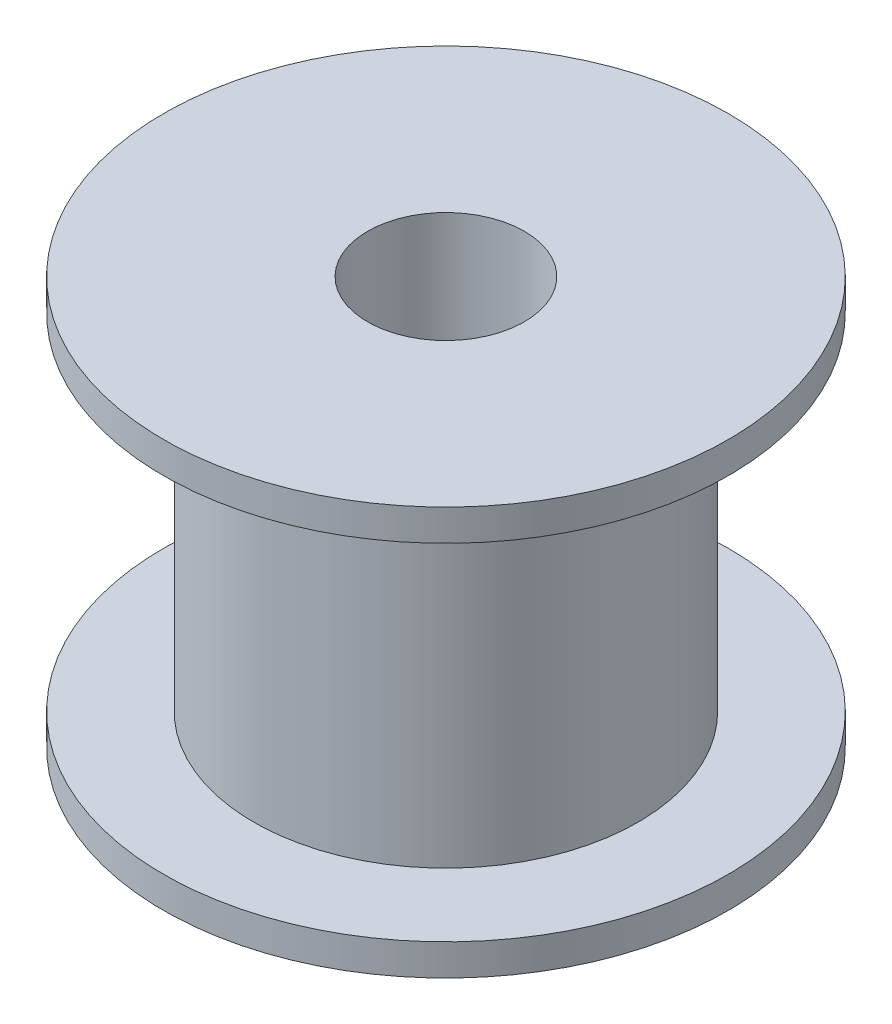
ISO-10303-21;
HEADER;
FILE_DESCRIPTION(('STEP AP214'),'2;1');
FILE_NAME('part.step','',(''),(''),'','','');
FILE_SCHEMA(('AUTOMOTIVE_DESIGN { 1 0 10303 214 1 1 1 1 }'));
ENDSEC;
DATA;
#1=APPLICATION_CONTEXT('core data for automotive mechanical design processes');
#2=APPLICATION_PROTOCOL_DEFINITION('international standard','automotive_design',2000,#1);
#3=PRODUCT_CONTEXT('',#1,'mechanical');
#4=PRODUCT('Part','Part','',(#3));
#5=PRODUCT_RELATED_PRODUCT_CATEGORY('part','',(#4));
#6=PRODUCT_DEFINITION_FORMATION('','',#4);
#7=PRODUCT_DEFINITION_CONTEXT('part definition',#1,'design');
#8=PRODUCT_DEFINITION('design','',#6,#7);
#9=PRODUCT_DEFINITION_SHAPE('','',#8);
#10=(LENGTH_UNIT() NAMED_UNIT(*) SI_UNIT(.MILLI.,.METRE.));
#11=(NAMED_UNIT(*) PLANE_ANGLE_UNIT() SI_UNIT($,.RADIAN.));
#12=(NAMED_UNIT(*) SI_UNIT($,.STERADIAN.) SOLID_ANGLE_UNIT());
#13=UNCERTAINTY_MEASURE_WITH_UNIT(LENGTH_MEASURE(1.E-05),#10,'distance_accuracy_value','');
#14=(GEOMETRIC_REPRESENTATION_CONTEXT(3) GLOBAL_UNCERTAINTY_ASSIGNED_CONTEXT((#13)) GLOBAL_UNIT_ASSIGNED_CONTEXT((#10,
#11,#12)) REPRESENTATION_CONTEXT('',''));
#15=CARTESIAN_POINT('',(0.,0.,0.));
#16=DIRECTION('',(0.,0.,1.));
#17=DIRECTION('',(1.,0.,0.));
#18=AXIS2_PLACEMENT_3D('',#15,#16,#17);
#19=CARTESIAN_POINT('',(9.,0.,0.));
#20=DIRECTION('',(0.,-1.,0.));
#21=DIRECTION('',(0.,0.,-1.));
#22=AXIS2_PLACEMENT_3D('',#19,#20,#21);
#23=PLANE('',#22);
#24=CARTESIAN_POINT('',(0.,0.,0.));
#25=DIRECTION('',(0.,-1.,0.));
#26=DIRECTION('',(0.,0.,-1.));
#27=AXIS2_PLACEMENT_3D('',#24,#25,#26);
#28=CIRCLE('',#27,9.);
#29=CARTESIAN_POINT('',(0.,0.,-9.));
#30=VERTEX_POINT('',#29);
#31=EDGE_CURVE('E63',#30,#30,#28,.T.);
#32=ORIENTED_EDGE('',*,*,#31,.T.);
#33=EDGE_LOOP('',(#32));
#34=FACE_BOUND('',#33,.T.);
#35=CARTESIAN_POINT('',(0.,0.,0.));
#36=DIRECTION('',(0.,-1.,0.));
#37=DIRECTION('',(0.,0.,-1.));
#38=AXIS2_PLACEMENT_3D('',#35,#36,#37);
#39=CIRCLE('',#38,2.5);
#40=CARTESIAN_POINT('',(0.,0.,-2.5));
#41=VERTEX_POINT('',#40);
#42=EDGE_CURVE('E10',#41,#41,#39,.T.);
#43=ORIENTED_EDGE('',*,*,#42,.F.);
#44=EDGE_LOOP('',(#43));
#45=FACE_BOUND('',#44,.T.);
#46=ADVANCED_FACE('F35',(#34,#45),#23,.T.);
#47=CARTESIAN_POINT('',(0.,0.,0.));
#48=DIRECTION('',(0.,-1.,0.));
#49=DIRECTION('',(0.,0.,-1.));
#50=AXIS2_PLACEMENT_3D('',#47,#48,#49);
#51=CYLINDRICAL_SURFACE('',#50,2.5);
#52=ORIENTED_EDGE('',*,*,#42,.T.);
#53=EDGE_LOOP('',(#52));
#54=FACE_BOUND('',#53,.T.);
#55=CARTESIAN_POINT('',(0.,13.,0.));
#56=DIRECTION('',(0.,-1.,0.));
#57=DIRECTION('',(0.,0.,-1.));
#58=AXIS2_PLACEMENT_3D('',#55,#56,#57);
#59=CIRCLE('',#58,2.5);
#60=CARTESIAN_POINT('',(0.,13.,-2.5));
#61=VERTEX_POINT('',#60);
#62=EDGE_CURVE('E41',#61,#61,#59,.T.);
#63=ORIENTED_EDGE('',*,*,#62,.F.);
#64=EDGE_LOOP('',(#63));
#65=FACE_BOUND('',#64,.T.);
#66=ADVANCED_FACE('F81',(#54,#65),#51,.F.);
#67=CARTESIAN_POINT('',(2.5,13.,0.));
#68=DIRECTION('',(0.,1.,0.));
#69=DIRECTION('',(0.,0.,1.));
#70=AXIS2_PLACEMENT_3D('',#67,#68,#69);
#71=PLANE('',#70);
#72=ORIENTED_EDGE('',*,*,#62,.T.);
#73=EDGE_LOOP('',(#72));
#74=FACE_BOUND('',#73,.T.);
#75=CARTESIAN_POINT('',(0.,13.,0.));
#76=DIRECTION('',(0.,-1.,0.));
#77=DIRECTION('',(0.,0.,-1.));
#78=AXIS2_PLACEMENT_3D('',#75,#76,#77);
#79=CIRCLE('',#78,9.);
#80=CARTESIAN_POINT('',(0.,13.,-9.));
#81=VERTEX_POINT('',#80);
#82=EDGE_CURVE('E45',#81,#81,#79,.T.);
#83=ORIENTED_EDGE('',*,*,#82,.F.);
#84=EDGE_LOOP('',(#83));
#85=FACE_BOUND('',#84,.T.);
#86=ADVANCED_FACE('F85',(#74,#85),#71,.T.);
#87=CARTESIAN_POINT('',(0.,0.,0.));
#88=DIRECTION('',(0.,-1.,0.));
#89=DIRECTION('',(0.,0.,-1.));
#90=AXIS2_PLACEMENT_3D('',#87,#88,#89);
#91=CYLINDRICAL_SURFACE('',#90,9.);
#92=ORIENTED_EDGE('',*,*,#82,.T.);
#93=EDGE_LOOP('',(#92));
#94=FACE_BOUND('',#93,.T.);
#95=CARTESIAN_POINT('',(0.,12.,0.));
#96=DIRECTION('',(0.,-1.,0.));
#97=DIRECTION('',(0.,0.,-1.));
#98=AXIS2_PLACEMENT_3D('',#95,#96,#97);
#99=CIRCLE('',#98,9.);
#100=CARTESIAN_POINT('',(0.,12.,-9.));
#101=VERTEX_POINT('',#100);
#102=EDGE_CURVE('E49',#101,#101,#99,.T.);
#103=ORIENTED_EDGE('',*,*,#102,.F.);
#104=EDGE_LOOP('',(#103));
#105=FACE_BOUND('',#104,.T.);
#106=ADVANCED_FACE('F89',(#94,#105),#91,.T.);
#107=CARTESIAN_POINT('',(9.,12.,0.));
#108=DIRECTION('',(0.,-1.,0.));
#109=DIRECTION('',(0.,0.,-1.));
#110=AXIS2_PLACEMENT_3D('',#107,#108,#109);
#111=PLANE('',#110);
#112=ORIENTED_EDGE('',*,*,#102,.T.);
#113=EDGE_LOOP('',(#112));
#114=FACE_BOUND('',#113,.T.);
#115=CARTESIAN_POINT('',(0.,12.,0.));
#116=DIRECTION('',(0.,-1.,0.));
#117=DIRECTION('',(0.,0.,-1.));
#118=AXIS2_PLACEMENT_3D('',#115,#116,#117);
#119=CIRCLE('',#118,6.125);
#120=CARTESIAN_POINT('',(0.,12.,-6.125));
#121=VERTEX_POINT('',#120);
#122=EDGE_CURVE('E54',#121,#121,#119,.T.);
#123=ORIENTED_EDGE('',*,*,#122,.F.);
#124=EDGE_LOOP('',(#123));
#125=FACE_BOUND('',#124,.T.);
#126=ADVANCED_FACE('F95',(#114,#125),#111,.T.);
#127=CARTESIAN_POINT('',(0.,0.,0.));
#128=DIRECTION('',(0.,-1.,0.));
#129=DIRECTION('',(0.,0.,-1.));
#130=AXIS2_PLACEMENT_3D('',#127,#128,#129);
#131=CYLINDRICAL_SURFACE('',#130,6.125);
#132=ORIENTED_EDGE('',*,*,#122,.T.);
#133=EDGE_LOOP('',(#132));
#134=FACE_BOUND('',#133,.T.);
#135=CARTESIAN_POINT('',(0.,1.,0.));
#136=DIRECTION('',(0.,-1.,0.));
#137=DIRECTION('',(0.,0.,-1.));
#138=AXIS2_PLACEMENT_3D('',#135,#136,#137);
#139=CIRCLE('',#138,6.125);
#140=CARTESIAN_POINT('',(0.,1.,-6.125));
#141=VERTEX_POINT('',#140);
#142=EDGE_CURVE('E57',#141,#141,#139,.T.);
#143=ORIENTED_EDGE('',*,*,#142,.F.);
#144=EDGE_LOOP('',(#143));
#145=FACE_BOUND('',#144,.T.);
#146=ADVANCED_FACE('F77',(#134,#145),#131,.T.);
#147=CARTESIAN_POINT('',(6.125,1.,0.));
#148=DIRECTION('',(0.,1.,0.));
#149=DIRECTION('',(0.,0.,1.));
#150=AXIS2_PLACEMENT_3D('',#147,#148,#149);
#151=PLANE('',#150);
#152=ORIENTED_EDGE('',*,*,#142,.T.);
#153=EDGE_LOOP('',(#152));
#154=FACE_BOUND('',#153,.T.);
#155=CARTESIAN_POINT('',(0.,1.,0.));
#156=DIRECTION('',(0.,-1.,0.));
#157=DIRECTION('',(0.,0.,-1.));
#158=AXIS2_PLACEMENT_3D('',#155,#156,#157);
#159=CIRCLE('',#158,9.);
#160=CARTESIAN_POINT('',(0.,1.,-9.));
#161=VERTEX_POINT('',#160);
#162=EDGE_CURVE('E60',#161,#161,#159,.T.);
#163=ORIENTED_EDGE('',*,*,#162,.F.);
#164=EDGE_LOOP('',(#163));
#165=FACE_BOUND('',#164,.T.);
#166=ADVANCED_FACE('F71',(#154,#165),#151,.T.);
#167=CARTESIAN_POINT('',(0.,0.,0.));
#168=DIRECTION('',(0.,-1.,0.));
#169=DIRECTION('',(0.,0.,-1.));
#170=AXIS2_PLACEMENT_3D('',#167,#168,#169);
#171=CYLINDRICAL_SURFACE('',#170,9.);
#172=ORIENTED_EDGE('',*,*,#162,.T.);
#173=EDGE_LOOP('',(#172));
#174=FACE_BOUND('',#173,.T.);
#175=ORIENTED_EDGE('',*,*,#31,.F.);
#176=EDGE_LOOP('',(#175));
#177=FACE_BOUND('',#176,.T.);
#178=ADVANCED_FACE('F69',(#174,#177),#171,.T.);
#179=CLOSED_SHELL('',(#46,#66,#86,#106,#126,#146,#166,#178));
#180=MANIFOLD_SOLID_BREP('B2',#179);
#181=ADVANCED_BREP_SHAPE_REPRESENTATION('',(#18,#180),#14);
#182=SHAPE_DEFINITION_REPRESENTATION(#9,#181);
ENDSEC;
END-ISO-10303-21;
